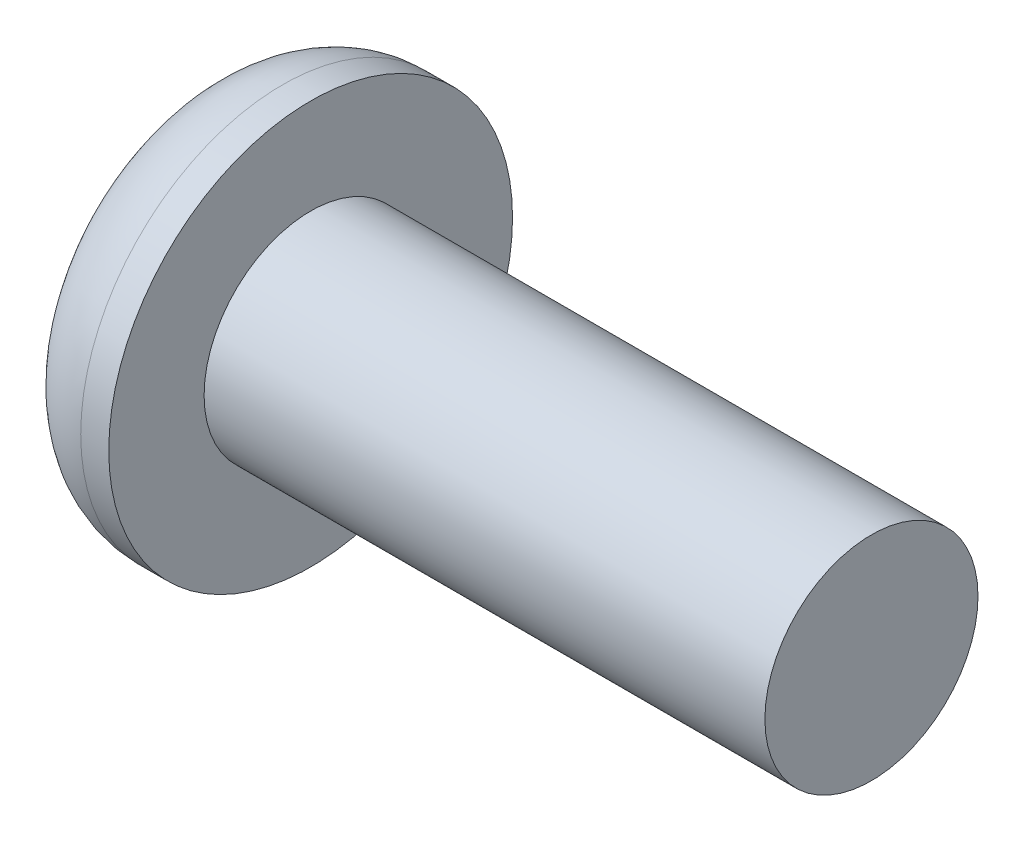
ISO-10303-21;
HEADER;
FILE_DESCRIPTION(('STEP AP214'),'2;1');
FILE_NAME('part.step','',(''),(''),'','','');
FILE_SCHEMA(('AUTOMOTIVE_DESIGN { 1 0 10303 214 1 1 1 1 }'));
ENDSEC;
DATA;
#1=APPLICATION_CONTEXT('core data for automotive mechanical design processes');
#2=APPLICATION_PROTOCOL_DEFINITION('international standard','automotive_design',2000,#1);
#3=PRODUCT_CONTEXT('',#1,'mechanical');
#4=PRODUCT('Part','Part','',(#3));
#5=PRODUCT_RELATED_PRODUCT_CATEGORY('part','',(#4));
#6=PRODUCT_DEFINITION_FORMATION('','',#4);
#7=PRODUCT_DEFINITION_CONTEXT('part definition',#1,'design');
#8=PRODUCT_DEFINITION('design','',#6,#7);
#9=PRODUCT_DEFINITION_SHAPE('','',#8);
#10=(LENGTH_UNIT() NAMED_UNIT(*) SI_UNIT(.MILLI.,.METRE.));
#11=(NAMED_UNIT(*) PLANE_ANGLE_UNIT() SI_UNIT($,.RADIAN.));
#12=(NAMED_UNIT(*) SI_UNIT($,.STERADIAN.) SOLID_ANGLE_UNIT());
#13=UNCERTAINTY_MEASURE_WITH_UNIT(LENGTH_MEASURE(1.E-05),#10,'distance_accuracy_value','');
#14=(GEOMETRIC_REPRESENTATION_CONTEXT(3) GLOBAL_UNCERTAINTY_ASSIGNED_CONTEXT((#13)) GLOBAL_UNIT_ASSIGNED_CONTEXT((#10,
#11,#12)) REPRESENTATION_CONTEXT('',''));
#15=CARTESIAN_POINT('',(0.,0.,0.));
#16=DIRECTION('',(0.,0.,1.));
#17=DIRECTION('',(1.,0.,0.));
#18=AXIS2_PLACEMENT_3D('',#15,#16,#17);
#19=CARTESIAN_POINT('',(2.54,0.,0.));
#20=DIRECTION('',(-1.,0.,0.));
#21=DIRECTION('',(0.,0.,1.));
#22=AXIS2_PLACEMENT_3D('',#19,#20,#21);
#23=CYLINDRICAL_SURFACE('',#22,4.572);
#24=CARTESIAN_POINT('',(1.905,0.,0.));
#25=DIRECTION('',(1.,0.,0.));
#26=DIRECTION('',(0.,0.,-1.));
#27=AXIS2_PLACEMENT_3D('',#24,#25,#26);
#28=CIRCLE('',#27,4.572);
#29=CARTESIAN_POINT('',(1.905,0.,-4.572));
#30=VERTEX_POINT('',#29);
#31=EDGE_CURVE('E47',#30,#30,#28,.T.);
#32=ORIENTED_EDGE('',*,*,#31,.T.);
#33=EDGE_LOOP('',(#32));
#34=FACE_BOUND('',#33,.T.);
#35=CARTESIAN_POINT('',(2.54,0.,0.));
#36=DIRECTION('',(1.,0.,0.));
#37=DIRECTION('',(0.,0.,-1.));
#38=AXIS2_PLACEMENT_3D('',#35,#36,#37);
#39=CIRCLE('',#38,4.572);
#40=CARTESIAN_POINT('',(2.54,0.,-4.572));
#41=VERTEX_POINT('',#40);
#42=EDGE_CURVE('E180',#41,#41,#39,.T.);
#43=ORIENTED_EDGE('',*,*,#42,.F.);
#44=EDGE_LOOP('',(#43));
#45=FACE_BOUND('',#44,.T.);
#46=ADVANCED_FACE('F38',(#34,#45),#23,.T.);
#47=CARTESIAN_POINT('',(2.54,0.,0.));
#48=DIRECTION('',(1.,0.,0.));
#49=DIRECTION('',(0.,0.,-1.));
#50=AXIS2_PLACEMENT_3D('',#47,#48,#49);
#51=PLANE('',#50);
#52=CARTESIAN_POINT('',(2.54,0.,0.));
#53=DIRECTION('',(1.,0.,0.));
#54=DIRECTION('',(0.,0.,-1.));
#55=AXIS2_PLACEMENT_3D('',#52,#53,#54);
#56=CIRCLE('',#55,2.413);
#57=CARTESIAN_POINT('',(2.54,0.,-2.413));
#58=VERTEX_POINT('',#57);
#59=EDGE_CURVE('E181',#58,#58,#56,.T.);
#60=ORIENTED_EDGE('',*,*,#59,.F.);
#61=EDGE_LOOP('',(#60));
#62=FACE_BOUND('',#61,.T.);
#63=ORIENTED_EDGE('',*,*,#42,.T.);
#64=EDGE_LOOP('',(#63));
#65=FACE_BOUND('',#64,.T.);
#66=ADVANCED_FACE('F208',(#62,#65),#51,.T.);
#67=CARTESIAN_POINT('',(0.,0.,0.));
#68=DIRECTION('',(1.,0.,0.));
#69=DIRECTION('',(0.,0.,-1.));
#70=AXIS2_PLACEMENT_3D('',#67,#68,#69);
#71=PLANE('',#70);
#72=DIRECTION('',(0.,0.999888133515311,0.0149572876975553));
#73=VECTOR('',#72,1.);
#74=CARTESIAN_POINT('',(0.,-0.940185716053139,1.5736134063559));
#75=LINE('',#74,#73);
#76=CARTESIAN_POINT('',(0.,-0.940185716053139,1.5736134063559));
#77=VERTEX_POINT('',#76);
#78=CARTESIAN_POINT('',(0.,0.892696327613401,1.60103141755523));
#79=VERTEX_POINT('',#78);
#80=EDGE_CURVE('E148',#77,#79,#75,.T.);
#81=ORIENTED_EDGE('',*,*,#80,.F.);
#82=DIRECTION('',(0.,0.48699067563986,0.873407168415644));
#83=VECTOR('',#82,1.);
#84=CARTESIAN_POINT('',(0.,-1.83288204366654,-0.0274180111993328));
#85=LINE('',#84,#83);
#86=CARTESIAN_POINT('',(0.,-1.83288204366654,-0.0274180111993328));
#87=VERTEX_POINT('',#86);
#88=EDGE_CURVE('E57',#87,#77,#85,.T.);
#89=ORIENTED_EDGE('',*,*,#88,.F.);
#90=DIRECTION('',(0.,-0.512897457875451,0.858449880718088));
#91=VECTOR('',#90,1.);
#92=CARTESIAN_POINT('',(0.,-0.892696327613401,-1.60103141755523));
#93=LINE('',#92,#91);
#94=CARTESIAN_POINT('',(0.,-0.892696327613401,-1.60103141755523));
#95=VERTEX_POINT('',#94);
#96=EDGE_CURVE('E161',#95,#87,#93,.T.);
#97=ORIENTED_EDGE('',*,*,#96,.F.);
#98=DIRECTION('',(0.,-0.999888133515311,-0.014957287697555));
#99=VECTOR('',#98,1.);
#100=CARTESIAN_POINT('',(0.,0.940185716053139,-1.5736134063559));
#101=LINE('',#100,#99);
#102=CARTESIAN_POINT('',(0.,0.940185716053139,-1.5736134063559));
#103=VERTEX_POINT('',#102);
#104=EDGE_CURVE('E158',#103,#95,#101,.T.);
#105=ORIENTED_EDGE('',*,*,#104,.F.);
#106=DIRECTION('',(0.,-0.48699067563986,-0.873407168415644));
#107=VECTOR('',#106,1.);
#108=CARTESIAN_POINT('',(0.,1.83288204366654,0.0274180111993334));
#109=LINE('',#108,#107);
#110=CARTESIAN_POINT('',(0.,1.83288204366654,0.0274180111993334));
#111=VERTEX_POINT('',#110);
#112=EDGE_CURVE('E114',#111,#103,#109,.T.);
#113=ORIENTED_EDGE('',*,*,#112,.F.);
#114=DIRECTION('',(0.,0.512897457875451,-0.858449880718088));
#115=VECTOR('',#114,1.);
#116=CARTESIAN_POINT('',(0.,0.892696327613401,1.60103141755523));
#117=LINE('',#116,#115);
#118=EDGE_CURVE('E152',#79,#111,#117,.T.);
#119=ORIENTED_EDGE('',*,*,#118,.F.);
#120=EDGE_LOOP('',(#81,#89,#97,#105,#113,#119));
#121=FACE_BOUND('',#120,.T.);
#122=CARTESIAN_POINT('',(0.,0.,0.));
#123=DIRECTION('',(1.,0.,0.));
#124=DIRECTION('',(0.,0.,-1.));
#125=AXIS2_PLACEMENT_3D('',#122,#123,#124);
#126=CIRCLE('',#125,2.667);
#127=CARTESIAN_POINT('',(0.,0.,-2.667));
#128=VERTEX_POINT('',#127);
#129=EDGE_CURVE('E11',#128,#128,#126,.F.);
#130=ORIENTED_EDGE('',*,*,#129,.T.);
#131=EDGE_LOOP('',(#130));
#132=FACE_BOUND('',#131,.T.);
#133=ADVANCED_FACE('F212',(#121,#132),#71,.F.);
#134=CARTESIAN_POINT('',(15.24,0.,0.));
#135=DIRECTION('',(-1.,0.,0.));
#136=DIRECTION('',(0.,0.,1.));
#137=AXIS2_PLACEMENT_3D('',#134,#135,#136);
#138=CYLINDRICAL_SURFACE('',#137,2.413);
#139=CARTESIAN_POINT('',(15.24,0.,0.));
#140=DIRECTION('',(1.,0.,0.));
#141=DIRECTION('',(0.,0.,-1.));
#142=AXIS2_PLACEMENT_3D('',#139,#140,#141);
#143=CIRCLE('',#142,2.413);
#144=CARTESIAN_POINT('',(15.24,0.,-2.413));
#145=VERTEX_POINT('',#144);
#146=EDGE_CURVE('E167',#145,#145,#143,.T.);
#147=ORIENTED_EDGE('',*,*,#146,.F.);
#148=EDGE_LOOP('',(#147));
#149=FACE_BOUND('',#148,.T.);
#150=ORIENTED_EDGE('',*,*,#59,.T.);
#151=EDGE_LOOP('',(#150));
#152=FACE_BOUND('',#151,.T.);
#153=ADVANCED_FACE('F203',(#149,#152),#138,.T.);
#154=CARTESIAN_POINT('',(15.24,0.,0.));
#155=DIRECTION('',(1.,0.,0.));
#156=DIRECTION('',(0.,0.,-1.));
#157=AXIS2_PLACEMENT_3D('',#154,#155,#156);
#158=PLANE('',#157);
#159=ORIENTED_EDGE('',*,*,#146,.T.);
#160=EDGE_LOOP('',(#159));
#161=FACE_BOUND('',#160,.T.);
#162=ADVANCED_FACE('F195',(#161),#158,.T.);
#163=CARTESIAN_POINT('',(1.905,0.,0.));
#164=DIRECTION('',(1.,0.,0.));
#165=DIRECTION('',(0.,0.,-1.));
#166=AXIS2_PLACEMENT_3D('',#163,#164,#165);
#167=TOROIDAL_SURFACE('',#166,2.667,1.905);
#168=ORIENTED_EDGE('',*,*,#129,.F.);
#169=EDGE_LOOP('',(#168));
#170=FACE_BOUND('',#169,.T.);
#171=ORIENTED_EDGE('',*,*,#31,.F.);
#172=EDGE_LOOP('',(#171));
#173=FACE_BOUND('',#172,.T.);
#174=ADVANCED_FACE('F40',(#170,#173),#167,.T.);
#175=CARTESIAN_POINT('',(1.905,-1.83288204366654,-0.0274180111993328));
#176=DIRECTION('',(0.,-0.873407168415644,0.48699067563986));
#177=DIRECTION('',(0.,-0.48699067563986,-0.873407168415644));
#178=AXIS2_PLACEMENT_3D('',#175,#176,#177);
#179=PLANE('',#178);
#180=ORIENTED_EDGE('',*,*,#88,.T.);
#181=DIRECTION('',(-1.,0.,0.));
#182=VECTOR('',#181,1.);
#183=CARTESIAN_POINT('',(1.905,-0.940185716053139,1.5736134063559));
#184=LINE('',#183,#182);
#185=CARTESIAN_POINT('',(1.905,-0.940185716053139,1.5736134063559));
#186=VERTEX_POINT('',#185);
#187=EDGE_CURVE('E95',#186,#77,#184,.T.);
#188=ORIENTED_EDGE('',*,*,#187,.F.);
#189=DIRECTION('',(0.,0.48699067563986,0.873407168415644));
#190=VECTOR('',#189,1.);
#191=CARTESIAN_POINT('',(1.905,-1.83288204366654,-0.0274180111993328));
#192=LINE('',#191,#190);
#193=CARTESIAN_POINT('',(1.905,-1.83288204366654,-0.0274180111993328));
#194=VERTEX_POINT('',#193);
#195=EDGE_CURVE('E164',#194,#186,#192,.T.);
#196=ORIENTED_EDGE('',*,*,#195,.F.);
#197=DIRECTION('',(-1.,0.,0.));
#198=VECTOR('',#197,1.);
#199=CARTESIAN_POINT('',(1.905,-1.83288204366654,-0.0274180111993328));
#200=LINE('',#199,#198);
#201=EDGE_CURVE('E68',#194,#87,#200,.T.);
#202=ORIENTED_EDGE('',*,*,#201,.T.);
#203=EDGE_LOOP('',(#180,#188,#196,#202));
#204=FACE_BOUND('',#203,.T.);
#205=ADVANCED_FACE('F194',(#204),#179,.F.);
#206=CARTESIAN_POINT('',(1.905,-0.892696327613401,-1.60103141755523));
#207=DIRECTION('',(0.,-0.858449880718088,-0.512897457875451));
#208=DIRECTION('',(0.,0.512897457875451,-0.858449880718088));
#209=AXIS2_PLACEMENT_3D('',#206,#207,#208);
#210=PLANE('',#209);
#211=ORIENTED_EDGE('',*,*,#96,.T.);
#212=ORIENTED_EDGE('',*,*,#201,.F.);
#213=DIRECTION('',(0.,-0.512897457875451,0.858449880718088));
#214=VECTOR('',#213,1.);
#215=CARTESIAN_POINT('',(1.905,-0.892696327613401,-1.60103141755523));
#216=LINE('',#215,#214);
#217=CARTESIAN_POINT('',(1.905,-0.892696327613401,-1.60103141755523));
#218=VERTEX_POINT('',#217);
#219=EDGE_CURVE('E128',#218,#194,#216,.T.);
#220=ORIENTED_EDGE('',*,*,#219,.F.);
#221=DIRECTION('',(-1.,0.,0.));
#222=VECTOR('',#221,1.);
#223=CARTESIAN_POINT('',(1.905,-0.892696327613401,-1.60103141755523));
#224=LINE('',#223,#222);
#225=EDGE_CURVE('E119',#218,#95,#224,.T.);
#226=ORIENTED_EDGE('',*,*,#225,.T.);
#227=EDGE_LOOP('',(#211,#212,#220,#226));
#228=FACE_BOUND('',#227,.T.);
#229=ADVANCED_FACE('F201',(#228),#210,.F.);
#230=CARTESIAN_POINT('',(1.905,0.940185716053139,-1.5736134063559));
#231=DIRECTION('',(0.,0.014957287697555,-0.999888133515311));
#232=DIRECTION('',(0.,0.999888133515311,0.014957287697555));
#233=AXIS2_PLACEMENT_3D('',#230,#231,#232);
#234=PLANE('',#233);
#235=ORIENTED_EDGE('',*,*,#104,.T.);
#236=ORIENTED_EDGE('',*,*,#225,.F.);
#237=DIRECTION('',(0.,-0.999888133515311,-0.014957287697555));
#238=VECTOR('',#237,1.);
#239=CARTESIAN_POINT('',(1.905,0.940185716053139,-1.5736134063559));
#240=LINE('',#239,#238);
#241=CARTESIAN_POINT('',(1.905,0.940185716053139,-1.5736134063559));
#242=VERTEX_POINT('',#241);
#243=EDGE_CURVE('E123',#242,#218,#240,.T.);
#244=ORIENTED_EDGE('',*,*,#243,.F.);
#245=DIRECTION('',(-1.,0.,0.));
#246=VECTOR('',#245,1.);
#247=CARTESIAN_POINT('',(1.905,0.940185716053139,-1.5736134063559));
#248=LINE('',#247,#246);
#249=EDGE_CURVE('E107',#242,#103,#248,.T.);
#250=ORIENTED_EDGE('',*,*,#249,.T.);
#251=EDGE_LOOP('',(#235,#236,#244,#250));
#252=FACE_BOUND('',#251,.T.);
#253=ADVANCED_FACE('F124',(#252),#234,.F.);
#254=CARTESIAN_POINT('',(1.905,1.83288204366654,0.0274180111993334));
#255=DIRECTION('',(0.,0.873407168415644,-0.48699067563986));
#256=DIRECTION('',(0.,0.48699067563986,0.873407168415644));
#257=AXIS2_PLACEMENT_3D('',#254,#255,#256);
#258=PLANE('',#257);
#259=ORIENTED_EDGE('',*,*,#112,.T.);
#260=ORIENTED_EDGE('',*,*,#249,.F.);
#261=DIRECTION('',(0.,-0.48699067563986,-0.873407168415644));
#262=VECTOR('',#261,1.);
#263=CARTESIAN_POINT('',(1.905,1.83288204366654,0.0274180111993334));
#264=LINE('',#263,#262);
#265=CARTESIAN_POINT('',(1.905,1.83288204366654,0.0274180111993334));
#266=VERTEX_POINT('',#265);
#267=EDGE_CURVE('E111',#266,#242,#264,.T.);
#268=ORIENTED_EDGE('',*,*,#267,.F.);
#269=DIRECTION('',(-1.,0.,0.));
#270=VECTOR('',#269,1.);
#271=CARTESIAN_POINT('',(1.905,1.83288204366654,0.0274180111993334));
#272=LINE('',#271,#270);
#273=EDGE_CURVE('E120',#266,#111,#272,.T.);
#274=ORIENTED_EDGE('',*,*,#273,.T.);
#275=EDGE_LOOP('',(#259,#260,#268,#274));
#276=FACE_BOUND('',#275,.T.);
#277=ADVANCED_FACE('F109',(#276),#258,.F.);
#278=CARTESIAN_POINT('',(1.905,0.892696327613401,1.60103141755523));
#279=DIRECTION('',(0.,0.858449880718088,0.512897457875451));
#280=DIRECTION('',(0.,-0.512897457875451,0.858449880718088));
#281=AXIS2_PLACEMENT_3D('',#278,#279,#280);
#282=PLANE('',#281);
#283=ORIENTED_EDGE('',*,*,#118,.T.);
#284=ORIENTED_EDGE('',*,*,#273,.F.);
#285=DIRECTION('',(0.,0.512897457875451,-0.858449880718088));
#286=VECTOR('',#285,1.);
#287=CARTESIAN_POINT('',(1.905,0.892696327613401,1.60103141755523));
#288=LINE('',#287,#286);
#289=CARTESIAN_POINT('',(1.905,0.892696327613401,1.60103141755523));
#290=VERTEX_POINT('',#289);
#291=EDGE_CURVE('E134',#290,#266,#288,.T.);
#292=ORIENTED_EDGE('',*,*,#291,.F.);
#293=DIRECTION('',(-1.,0.,0.));
#294=VECTOR('',#293,1.);
#295=CARTESIAN_POINT('',(1.905,0.892696327613401,1.60103141755523));
#296=LINE('',#295,#294);
#297=EDGE_CURVE('E172',#290,#79,#296,.T.);
#298=ORIENTED_EDGE('',*,*,#297,.T.);
#299=EDGE_LOOP('',(#283,#284,#292,#298));
#300=FACE_BOUND('',#299,.T.);
#301=ADVANCED_FACE('F225',(#300),#282,.F.);
#302=CARTESIAN_POINT('',(1.905,-0.940185716053139,1.5736134063559));
#303=DIRECTION('',(0.,-0.0149572876975553,0.999888133515311));
#304=DIRECTION('',(0.,-0.999888133515311,-0.0149572876975553));
#305=AXIS2_PLACEMENT_3D('',#302,#303,#304);
#306=PLANE('',#305);
#307=ORIENTED_EDGE('',*,*,#80,.T.);
#308=ORIENTED_EDGE('',*,*,#297,.F.);
#309=DIRECTION('',(0.,0.999888133515311,0.0149572876975553));
#310=VECTOR('',#309,1.);
#311=CARTESIAN_POINT('',(1.905,-0.940185716053139,1.5736134063559));
#312=LINE('',#311,#310);
#313=EDGE_CURVE('E140',#186,#290,#312,.T.);
#314=ORIENTED_EDGE('',*,*,#313,.F.);
#315=ORIENTED_EDGE('',*,*,#187,.T.);
#316=EDGE_LOOP('',(#307,#308,#314,#315));
#317=FACE_BOUND('',#316,.T.);
#318=ADVANCED_FACE('F222',(#317),#306,.F.);
#319=CARTESIAN_POINT('',(1.905,0.,0.));
#320=DIRECTION('',(-1.,0.,0.));
#321=DIRECTION('',(0.,0.,1.));
#322=AXIS2_PLACEMENT_3D('',#319,#320,#321);
#323=PLANE('',#322);
#324=ORIENTED_EDGE('',*,*,#195,.T.);
#325=ORIENTED_EDGE('',*,*,#313,.T.);
#326=ORIENTED_EDGE('',*,*,#291,.T.);
#327=ORIENTED_EDGE('',*,*,#267,.T.);
#328=ORIENTED_EDGE('',*,*,#243,.T.);
#329=ORIENTED_EDGE('',*,*,#219,.T.);
#330=EDGE_LOOP('',(#324,#325,#326,#327,#328,#329));
#331=FACE_BOUND('',#330,.T.);
#332=ADVANCED_FACE('F131',(#331),#323,.T.);
#333=CLOSED_SHELL('',(#46,#66,#133,#153,#162,#174,#205,#229,#253,#277,#301,#318,#332));
#334=MANIFOLD_SOLID_BREP('B2',#333);
#335=ADVANCED_BREP_SHAPE_REPRESENTATION('',(#18,#334),#14);
#336=SHAPE_DEFINITION_REPRESENTATION(#9,#335);
ENDSEC;
END-ISO-10303-21;
